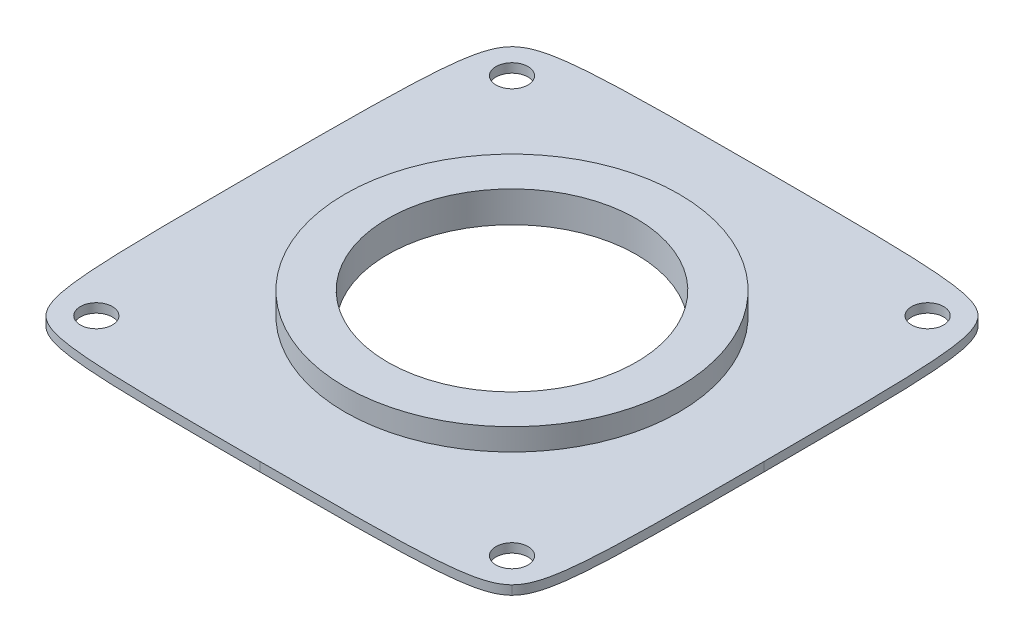
ISO-10303-21;
HEADER;
FILE_DESCRIPTION(('STEP AP214'),'2;1');
FILE_NAME('part.step','',(''),(''),'','','');
FILE_SCHEMA(('AUTOMOTIVE_DESIGN { 1 0 10303 214 1 1 1 1 }'));
ENDSEC;
DATA;
#1=APPLICATION_CONTEXT('core data for automotive mechanical design processes');
#2=APPLICATION_PROTOCOL_DEFINITION('international standard','automotive_design',2000,#1);
#3=PRODUCT_CONTEXT('',#1,'mechanical');
#4=PRODUCT('Part','Part','',(#3));
#5=PRODUCT_RELATED_PRODUCT_CATEGORY('part','',(#4));
#6=PRODUCT_DEFINITION_FORMATION('','',#4);
#7=PRODUCT_DEFINITION_CONTEXT('part definition',#1,'design');
#8=PRODUCT_DEFINITION('design','',#6,#7);
#9=PRODUCT_DEFINITION_SHAPE('','',#8);
#10=(LENGTH_UNIT() NAMED_UNIT(*) SI_UNIT(.MILLI.,.METRE.));
#11=(NAMED_UNIT(*) PLANE_ANGLE_UNIT() SI_UNIT($,.RADIAN.));
#12=(NAMED_UNIT(*) SI_UNIT($,.STERADIAN.) SOLID_ANGLE_UNIT());
#13=UNCERTAINTY_MEASURE_WITH_UNIT(LENGTH_MEASURE(1.E-05),#10,'distance_accuracy_value','');
#14=(GEOMETRIC_REPRESENTATION_CONTEXT(3) GLOBAL_UNCERTAINTY_ASSIGNED_CONTEXT((#13)) GLOBAL_UNIT_ASSIGNED_CONTEXT((#10,
#11,#12)) REPRESENTATION_CONTEXT('',''));
#15=CARTESIAN_POINT('',(0.,0.,0.));
#16=DIRECTION('',(0.,0.,1.));
#17=DIRECTION('',(1.,0.,0.));
#18=AXIS2_PLACEMENT_3D('',#15,#16,#17);
#19=CARTESIAN_POINT('',(24.4868745850218,1.28,-35.083973076749));
#20=DIRECTION('',(0.,1.,0.));
#21=DIRECTION('',(0.,0.,1.));
#22=AXIS2_PLACEMENT_3D('',#19,#20,#21);
#23=PLANE('',#22);
#24=CARTESIAN_POINT('',(0.,1.28,0.));
#25=DIRECTION('',(0.,1.,0.));
#26=DIRECTION('',(0.,0.,1.));
#27=AXIS2_PLACEMENT_3D('',#24,#25,#26);
#28=CIRCLE('',#27,23.5);
#29=CARTESIAN_POINT('',(0.,1.28,23.5));
#30=VERTEX_POINT('',#29);
#31=EDGE_CURVE('E252',#30,#30,#28,.T.);
#32=ORIENTED_EDGE('',*,*,#31,.F.);
#33=EDGE_LOOP('',(#32));
#34=FACE_BOUND('',#33,.T.);
#35=CARTESIAN_POINT('',(-29.2530075376859,1.28,29.2530075376891));
#36=DIRECTION('',(0.,1.,0.));
#37=DIRECTION('',(0.,0.,1.));
#38=AXIS2_PLACEMENT_3D('',#35,#36,#37);
#39=CIRCLE('',#38,2.2500000000012);
#40=CARTESIAN_POINT('',(-29.2530075376859,1.28,27.0030075376879));
#41=VERTEX_POINT('',#40);
#42=EDGE_CURVE('E260',#41,#41,#39,.T.);
#43=ORIENTED_EDGE('',*,*,#42,.F.);
#44=EDGE_LOOP('',(#43));
#45=FACE_BOUND('',#44,.T.);
#46=CARTESIAN_POINT('',(32.7950697151676,1.28,-32.7950697151676));
#47=CARTESIAN_POINT('',(30.2979011307272,1.28,-35.292238299608));
#48=CARTESIAN_POINT('',(24.0687411909418,1.28,-35.5));
#49=CARTESIAN_POINT('',(0.,1.28,-35.5));
#50=B_SPLINE_CURVE_WITH_KNOTS('',3,(#46,#47,#48,#49),.UNSPECIFIED.,.F.,.F.,(4,4),(0.,1.),.UNSPECIFIED.);
#51=CARTESIAN_POINT('',(32.7950697151676,1.28,-32.7950697151676));
#52=VERTEX_POINT('',#51);
#53=CARTESIAN_POINT('',(0.,1.28,-35.5));
#54=VERTEX_POINT('',#53);
#55=EDGE_CURVE('E280',#52,#54,#50,.T.);
#56=ORIENTED_EDGE('',*,*,#55,.T.);
#57=CARTESIAN_POINT('',(0.,1.28,-35.5));
#58=CARTESIAN_POINT('',(-24.0687411909418,1.28,-35.5));
#59=CARTESIAN_POINT('',(-30.2979011307272,1.28,-35.292238299608));
#60=CARTESIAN_POINT('',(-32.7950697151676,1.28,-32.7950697151676));
#61=B_SPLINE_CURVE_WITH_KNOTS('',3,(#57,#58,#59,#60),.UNSPECIFIED.,.F.,.F.,(4,4),(0.,1.),.UNSPECIFIED.);
#62=CARTESIAN_POINT('',(-32.7950697151676,1.28,-32.7950697151676));
#63=VERTEX_POINT('',#62);
#64=EDGE_CURVE('E102',#54,#63,#61,.T.);
#65=ORIENTED_EDGE('',*,*,#64,.T.);
#66=CARTESIAN_POINT('',(-32.7950697151676,1.28,-32.7950697151676));
#67=CARTESIAN_POINT('',(-35.292238299608,1.28,-30.2979011307272));
#68=CARTESIAN_POINT('',(-35.5,1.28,-24.0687411909418));
#69=CARTESIAN_POINT('',(-35.5,1.28,0.));
#70=B_SPLINE_CURVE_WITH_KNOTS('',3,(#66,#67,#68,#69),.UNSPECIFIED.,.F.,.F.,(4,4),(0.,1.),.UNSPECIFIED.);
#71=CARTESIAN_POINT('',(-35.5,1.28,0.));
#72=VERTEX_POINT('',#71);
#73=EDGE_CURVE('E177',#63,#72,#70,.T.);
#74=ORIENTED_EDGE('',*,*,#73,.T.);
#75=CARTESIAN_POINT('',(-35.5,1.28,0.));
#76=CARTESIAN_POINT('',(-35.5,1.28,24.0687411909418));
#77=CARTESIAN_POINT('',(-35.292238299608,1.28,30.2979011307272));
#78=CARTESIAN_POINT('',(-32.7950697151676,1.28,32.7950697151676));
#79=B_SPLINE_CURVE_WITH_KNOTS('',3,(#75,#76,#77,#78),.UNSPECIFIED.,.F.,.F.,(4,4),(0.,1.),.UNSPECIFIED.);
#80=CARTESIAN_POINT('',(-32.7950697151676,1.28,32.7950697151676));
#81=VERTEX_POINT('',#80);
#82=EDGE_CURVE('E169',#72,#81,#79,.T.);
#83=ORIENTED_EDGE('',*,*,#82,.T.);
#84=CARTESIAN_POINT('',(-32.7950697151676,1.28,32.7950697151676));
#85=CARTESIAN_POINT('',(-30.2979011307272,1.28,35.2922382996081));
#86=CARTESIAN_POINT('',(-24.0687411909418,1.28,35.5));
#87=CARTESIAN_POINT('',(0.,1.28,35.5));
#88=B_SPLINE_CURVE_WITH_KNOTS('',3,(#84,#85,#86,#87),.UNSPECIFIED.,.F.,.F.,(4,4),(0.,1.),.UNSPECIFIED.);
#89=CARTESIAN_POINT('',(0.,1.28,35.5));
#90=VERTEX_POINT('',#89);
#91=EDGE_CURVE('E121',#81,#90,#88,.T.);
#92=ORIENTED_EDGE('',*,*,#91,.T.);
#93=CARTESIAN_POINT('',(0.,1.28,35.5));
#94=CARTESIAN_POINT('',(24.0687411909418,1.28,35.5));
#95=CARTESIAN_POINT('',(30.2979011307272,1.28,35.292238299608));
#96=CARTESIAN_POINT('',(32.7950697151676,1.28,32.7950697151676));
#97=B_SPLINE_CURVE_WITH_KNOTS('',3,(#93,#94,#95,#96),.UNSPECIFIED.,.F.,.F.,(4,4),(0.,1.),.UNSPECIFIED.);
#98=CARTESIAN_POINT('',(32.7950697151676,1.28,32.7950697151676));
#99=VERTEX_POINT('',#98);
#100=EDGE_CURVE('E115',#90,#99,#97,.T.);
#101=ORIENTED_EDGE('',*,*,#100,.T.);
#102=CARTESIAN_POINT('',(32.7950697151676,1.28,32.7950697151676));
#103=CARTESIAN_POINT('',(35.2922382996081,1.28,30.2979011307272));
#104=CARTESIAN_POINT('',(35.5,1.28,24.0687411909418));
#105=CARTESIAN_POINT('',(35.5,1.28,0.));
#106=B_SPLINE_CURVE_WITH_KNOTS('',3,(#102,#103,#104,#105),.UNSPECIFIED.,.F.,.F.,(4,4),(0.,1.),.UNSPECIFIED.);
#107=CARTESIAN_POINT('',(35.5,1.28,0.));
#108=VERTEX_POINT('',#107);
#109=EDGE_CURVE('E119',#99,#108,#106,.T.);
#110=ORIENTED_EDGE('',*,*,#109,.T.);
#111=CARTESIAN_POINT('',(35.5,1.28,0.));
#112=CARTESIAN_POINT('',(35.5,1.28,-24.0687411909418));
#113=CARTESIAN_POINT('',(35.292238299608,1.28,-30.2979011307272));
#114=CARTESIAN_POINT('',(32.7950697151676,1.28,-32.7950697151676));
#115=B_SPLINE_CURVE_WITH_KNOTS('',3,(#111,#112,#113,#114),.UNSPECIFIED.,.F.,.F.,(4,4),(0.,1.),.UNSPECIFIED.);
#116=EDGE_CURVE('E59',#108,#52,#115,.T.);
#117=ORIENTED_EDGE('',*,*,#116,.T.);
#118=EDGE_LOOP('',(#56,#65,#74,#83,#92,#101,#110,#117));
#119=FACE_BOUND('',#118,.T.);
#120=CARTESIAN_POINT('',(29.2530075376875,1.28,-29.2530075376875));
#121=DIRECTION('',(0.,1.,0.));
#122=DIRECTION('',(0.,0.,1.));
#123=AXIS2_PLACEMENT_3D('',#120,#121,#122);
#124=CIRCLE('',#123,2.25);
#125=CARTESIAN_POINT('',(29.2530075376875,1.28,-31.5030075376875));
#126=VERTEX_POINT('',#125);
#127=EDGE_CURVE('E275',#126,#126,#124,.T.);
#128=ORIENTED_EDGE('',*,*,#127,.F.);
#129=EDGE_LOOP('',(#128));
#130=FACE_BOUND('',#129,.T.);
#131=CARTESIAN_POINT('',(29.2530075376891,1.28,29.2530075376875));
#132=DIRECTION('',(0.,1.,0.));
#133=DIRECTION('',(0.,0.,1.));
#134=AXIS2_PLACEMENT_3D('',#131,#132,#133);
#135=CIRCLE('',#134,2.24999999999958);
#136=CARTESIAN_POINT('',(29.2530075376891,1.28,27.0030075376879));
#137=VERTEX_POINT('',#136);
#138=EDGE_CURVE('E266',#137,#137,#135,.T.);
#139=ORIENTED_EDGE('',*,*,#138,.F.);
#140=EDGE_LOOP('',(#139));
#141=FACE_BOUND('',#140,.T.);
#142=CARTESIAN_POINT('',(-29.2530075376875,1.28,-29.2530075376858));
#143=DIRECTION('',(0.,1.,0.));
#144=DIRECTION('',(0.,0.,1.));
#145=AXIS2_PLACEMENT_3D('',#142,#143,#144);
#146=CIRCLE('',#145,2.25000000000175);
#147=CARTESIAN_POINT('',(-29.2530075376875,1.28,-31.5030075376876));
#148=VERTEX_POINT('',#147);
#149=EDGE_CURVE('E250',#148,#148,#146,.T.);
#150=ORIENTED_EDGE('',*,*,#149,.F.);
#151=EDGE_LOOP('',(#150));
#152=FACE_BOUND('',#151,.T.);
#153=ADVANCED_FACE('F41',(#34,#45,#119,#130,#141,#152),#23,.T.);
#154=CARTESIAN_POINT('',(24.4868745850218,0.,-35.083973076749));
#155=DIRECTION('',(0.,1.,0.));
#156=DIRECTION('',(0.,0.,1.));
#157=AXIS2_PLACEMENT_3D('',#154,#155,#156);
#158=PLANE('',#157);
#159=CARTESIAN_POINT('',(32.7950697151676,0.,-32.7950697151676));
#160=CARTESIAN_POINT('',(30.2979011307272,0.,-35.292238299608));
#161=CARTESIAN_POINT('',(24.0687411909418,0.,-35.5));
#162=CARTESIAN_POINT('',(0.,0.,-35.5));
#163=B_SPLINE_CURVE_WITH_KNOTS('',3,(#159,#160,#161,#162),.UNSPECIFIED.,.F.,.F.,(4,4),(0.,1.),.UNSPECIFIED.);
#164=CARTESIAN_POINT('',(32.7950697151676,0.,-32.7950697151676));
#165=VERTEX_POINT('',#164);
#166=CARTESIAN_POINT('',(0.,0.,-35.5));
#167=VERTEX_POINT('',#166);
#168=EDGE_CURVE('E278',#165,#167,#163,.T.);
#169=ORIENTED_EDGE('',*,*,#168,.F.);
#170=CARTESIAN_POINT('',(35.5,0.,0.));
#171=CARTESIAN_POINT('',(35.5,0.,-24.0687411909418));
#172=CARTESIAN_POINT('',(35.292238299608,0.,-30.2979011307272));
#173=CARTESIAN_POINT('',(32.7950697151676,0.,-32.7950697151676));
#174=B_SPLINE_CURVE_WITH_KNOTS('',3,(#170,#171,#172,#173),.UNSPECIFIED.,.F.,.F.,(4,4),(0.,1.),.UNSPECIFIED.);
#175=CARTESIAN_POINT('',(35.5,0.,0.));
#176=VERTEX_POINT('',#175);
#177=EDGE_CURVE('E94',#176,#165,#174,.T.);
#178=ORIENTED_EDGE('',*,*,#177,.F.);
#179=CARTESIAN_POINT('',(32.7950697151676,0.,32.7950697151676));
#180=CARTESIAN_POINT('',(35.2922382996081,0.,30.2979011307272));
#181=CARTESIAN_POINT('',(35.5,0.,24.0687411909418));
#182=CARTESIAN_POINT('',(35.5,0.,0.));
#183=B_SPLINE_CURVE_WITH_KNOTS('',3,(#179,#180,#181,#182),.UNSPECIFIED.,.F.,.F.,(4,4),(0.,1.),.UNSPECIFIED.);
#184=CARTESIAN_POINT('',(32.7950697151676,0.,32.7950697151676));
#185=VERTEX_POINT('',#184);
#186=EDGE_CURVE('E88',#185,#176,#183,.T.);
#187=ORIENTED_EDGE('',*,*,#186,.F.);
#188=CARTESIAN_POINT('',(0.,0.,35.5));
#189=CARTESIAN_POINT('',(24.0687411909418,0.,35.5));
#190=CARTESIAN_POINT('',(30.2979011307272,0.,35.292238299608));
#191=CARTESIAN_POINT('',(32.7950697151676,0.,32.7950697151676));
#192=B_SPLINE_CURVE_WITH_KNOTS('',3,(#188,#189,#190,#191),.UNSPECIFIED.,.F.,.F.,(4,4),(0.,1.),.UNSPECIFIED.);
#193=CARTESIAN_POINT('',(0.,0.,35.5));
#194=VERTEX_POINT('',#193);
#195=EDGE_CURVE('E129',#194,#185,#192,.T.);
#196=ORIENTED_EDGE('',*,*,#195,.F.);
#197=CARTESIAN_POINT('',(-32.7950697151676,0.,32.7950697151676));
#198=CARTESIAN_POINT('',(-30.2979011307272,0.,35.2922382996081));
#199=CARTESIAN_POINT('',(-24.0687411909418,0.,35.5));
#200=CARTESIAN_POINT('',(0.,0.,35.5));
#201=B_SPLINE_CURVE_WITH_KNOTS('',3,(#197,#198,#199,#200),.UNSPECIFIED.,.F.,.F.,(4,4),(0.,1.),.UNSPECIFIED.);
#202=CARTESIAN_POINT('',(-32.7950697151676,0.,32.7950697151676));
#203=VERTEX_POINT('',#202);
#204=EDGE_CURVE('E320',#203,#194,#201,.T.);
#205=ORIENTED_EDGE('',*,*,#204,.F.);
#206=CARTESIAN_POINT('',(-35.5,0.,0.));
#207=CARTESIAN_POINT('',(-35.5,0.,24.0687411909418));
#208=CARTESIAN_POINT('',(-35.292238299608,0.,30.2979011307272));
#209=CARTESIAN_POINT('',(-32.7950697151676,0.,32.7950697151676));
#210=B_SPLINE_CURVE_WITH_KNOTS('',3,(#206,#207,#208,#209),.UNSPECIFIED.,.F.,.F.,(4,4),(0.,1.),.UNSPECIFIED.);
#211=CARTESIAN_POINT('',(-35.5,0.,0.));
#212=VERTEX_POINT('',#211);
#213=EDGE_CURVE('E318',#212,#203,#210,.T.);
#214=ORIENTED_EDGE('',*,*,#213,.F.);
#215=CARTESIAN_POINT('',(-32.7950697151676,0.,-32.7950697151676));
#216=CARTESIAN_POINT('',(-35.292238299608,0.,-30.2979011307272));
#217=CARTESIAN_POINT('',(-35.5,0.,-24.0687411909418));
#218=CARTESIAN_POINT('',(-35.5,0.,0.));
#219=B_SPLINE_CURVE_WITH_KNOTS('',3,(#215,#216,#217,#218),.UNSPECIFIED.,.F.,.F.,(4,4),(0.,1.),.UNSPECIFIED.);
#220=CARTESIAN_POINT('',(-32.7950697151676,0.,-32.7950697151676));
#221=VERTEX_POINT('',#220);
#222=EDGE_CURVE('E312',#221,#212,#219,.T.);
#223=ORIENTED_EDGE('',*,*,#222,.F.);
#224=CARTESIAN_POINT('',(0.,0.,-35.5));
#225=CARTESIAN_POINT('',(-24.0687411909418,0.,-35.5));
#226=CARTESIAN_POINT('',(-30.2979011307272,0.,-35.292238299608));
#227=CARTESIAN_POINT('',(-32.7950697151676,0.,-32.7950697151676));
#228=B_SPLINE_CURVE_WITH_KNOTS('',3,(#224,#225,#226,#227),.UNSPECIFIED.,.F.,.F.,(4,4),(0.,1.),.UNSPECIFIED.);
#229=EDGE_CURVE('E316',#167,#221,#228,.T.);
#230=ORIENTED_EDGE('',*,*,#229,.F.);
#231=EDGE_LOOP('',(#169,#178,#187,#196,#205,#214,#223,#230));
#232=FACE_BOUND('',#231,.T.);
#233=CARTESIAN_POINT('',(29.2530075376875,0.,-29.2530075376875));
#234=DIRECTION('',(0.,1.,0.));
#235=DIRECTION('',(0.,0.,1.));
#236=AXIS2_PLACEMENT_3D('',#233,#234,#235);
#237=CIRCLE('',#236,2.25);
#238=CARTESIAN_POINT('',(29.2530075376875,0.,-31.5030075376875));
#239=VERTEX_POINT('',#238);
#240=EDGE_CURVE('E274',#239,#239,#237,.T.);
#241=ORIENTED_EDGE('',*,*,#240,.T.);
#242=EDGE_LOOP('',(#241));
#243=FACE_BOUND('',#242,.T.);
#244=CARTESIAN_POINT('',(0.,0.,0.));
#245=DIRECTION('',(0.,1.,0.));
#246=DIRECTION('',(0.,0.,1.));
#247=AXIS2_PLACEMENT_3D('',#244,#245,#246);
#248=CIRCLE('',#247,17.5);
#249=CARTESIAN_POINT('',(0.,0.,-17.5));
#250=VERTEX_POINT('',#249);
#251=EDGE_CURVE('E269',#250,#250,#248,.T.);
#252=ORIENTED_EDGE('',*,*,#251,.T.);
#253=EDGE_LOOP('',(#252));
#254=FACE_BOUND('',#253,.T.);
#255=CARTESIAN_POINT('',(29.2530075376891,0.,29.2530075376875));
#256=DIRECTION('',(0.,1.,0.));
#257=DIRECTION('',(0.,0.,1.));
#258=AXIS2_PLACEMENT_3D('',#255,#256,#257);
#259=CIRCLE('',#258,2.24999999999958);
#260=CARTESIAN_POINT('',(29.2530075376891,0.,27.0030075376879));
#261=VERTEX_POINT('',#260);
#262=EDGE_CURVE('E263',#261,#261,#259,.T.);
#263=ORIENTED_EDGE('',*,*,#262,.T.);
#264=EDGE_LOOP('',(#263));
#265=FACE_BOUND('',#264,.T.);
#266=CARTESIAN_POINT('',(-29.2530075376859,0.,29.2530075376891));
#267=DIRECTION('',(0.,1.,0.));
#268=DIRECTION('',(0.,0.,1.));
#269=AXIS2_PLACEMENT_3D('',#266,#267,#268);
#270=CIRCLE('',#269,2.2500000000012);
#271=CARTESIAN_POINT('',(-29.2530075376859,0.,27.0030075376879));
#272=VERTEX_POINT('',#271);
#273=EDGE_CURVE('E258',#272,#272,#270,.T.);
#274=ORIENTED_EDGE('',*,*,#273,.T.);
#275=EDGE_LOOP('',(#274));
#276=FACE_BOUND('',#275,.T.);
#277=CARTESIAN_POINT('',(-29.2530075376875,0.,-29.2530075376858));
#278=DIRECTION('',(0.,1.,0.));
#279=DIRECTION('',(0.,0.,1.));
#280=AXIS2_PLACEMENT_3D('',#277,#278,#279);
#281=CIRCLE('',#280,2.25000000000175);
#282=CARTESIAN_POINT('',(-29.2530075376875,0.,-31.5030075376876));
#283=VERTEX_POINT('',#282);
#284=EDGE_CURVE('E247',#283,#283,#281,.T.);
#285=ORIENTED_EDGE('',*,*,#284,.T.);
#286=EDGE_LOOP('',(#285));
#287=FACE_BOUND('',#286,.T.);
#288=ADVANCED_FACE('F199',(#232,#243,#254,#265,#276,#287),#158,.F.);
#289=DIRECTION('',(0.,-1.,0.));
#290=VECTOR('',#289,1.);
#291=SURFACE_OF_LINEAR_EXTRUSION('',#50,#290);
#292=ORIENTED_EDGE('',*,*,#168,.T.);
#293=DIRECTION('',(0.,-1.,0.));
#294=VECTOR('',#293,1.);
#295=CARTESIAN_POINT('',(0.,1.28,-35.5));
#296=LINE('',#295,#294);
#297=EDGE_CURVE('E11',#54,#167,#296,.T.);
#298=ORIENTED_EDGE('',*,*,#297,.F.);
#299=ORIENTED_EDGE('',*,*,#55,.F.);
#300=DIRECTION('',(0.,-1.,0.));
#301=VECTOR('',#300,1.);
#302=CARTESIAN_POINT('',(32.7950697151676,1.28,-32.7950697151676));
#303=LINE('',#302,#301);
#304=EDGE_CURVE('E135',#52,#165,#303,.T.);
#305=ORIENTED_EDGE('',*,*,#304,.T.);
#306=EDGE_LOOP('',(#292,#298,#299,#305));
#307=FACE_BOUND('',#306,.T.);
#308=ADVANCED_FACE('F43',(#307),#291,.F.);
#309=DIRECTION('',(0.,-1.,0.));
#310=VECTOR('',#309,1.);
#311=SURFACE_OF_LINEAR_EXTRUSION('',#61,#310);
#312=ORIENTED_EDGE('',*,*,#229,.T.);
#313=DIRECTION('',(0.,-1.,0.));
#314=VECTOR('',#313,1.);
#315=CARTESIAN_POINT('',(-32.7950697151676,1.28,-32.7950697151676));
#316=LINE('',#315,#314);
#317=EDGE_CURVE('E51',#63,#221,#316,.T.);
#318=ORIENTED_EDGE('',*,*,#317,.F.);
#319=ORIENTED_EDGE('',*,*,#64,.F.);
#320=ORIENTED_EDGE('',*,*,#297,.T.);
#321=EDGE_LOOP('',(#312,#318,#319,#320));
#322=FACE_BOUND('',#321,.T.);
#323=ADVANCED_FACE('F193',(#322),#311,.F.);
#324=DIRECTION('',(0.,-1.,0.));
#325=VECTOR('',#324,1.);
#326=SURFACE_OF_LINEAR_EXTRUSION('',#70,#325);
#327=ORIENTED_EDGE('',*,*,#222,.T.);
#328=DIRECTION('',(0.,-1.,0.));
#329=VECTOR('',#328,1.);
#330=CARTESIAN_POINT('',(-35.5,1.28,0.));
#331=LINE('',#330,#329);
#332=EDGE_CURVE('E306',#72,#212,#331,.T.);
#333=ORIENTED_EDGE('',*,*,#332,.F.);
#334=ORIENTED_EDGE('',*,*,#73,.F.);
#335=ORIENTED_EDGE('',*,*,#317,.T.);
#336=EDGE_LOOP('',(#327,#333,#334,#335));
#337=FACE_BOUND('',#336,.T.);
#338=ADVANCED_FACE('F191',(#337),#326,.F.);
#339=DIRECTION('',(0.,-1.,0.));
#340=VECTOR('',#339,1.);
#341=SURFACE_OF_LINEAR_EXTRUSION('',#79,#340);
#342=ORIENTED_EDGE('',*,*,#213,.T.);
#343=DIRECTION('',(0.,-1.,0.));
#344=VECTOR('',#343,1.);
#345=CARTESIAN_POINT('',(-32.7950697151676,1.28,32.7950697151676));
#346=LINE('',#345,#344);
#347=EDGE_CURVE('E303',#81,#203,#346,.T.);
#348=ORIENTED_EDGE('',*,*,#347,.F.);
#349=ORIENTED_EDGE('',*,*,#82,.F.);
#350=ORIENTED_EDGE('',*,*,#332,.T.);
#351=EDGE_LOOP('',(#342,#348,#349,#350));
#352=FACE_BOUND('',#351,.T.);
#353=ADVANCED_FACE('F162',(#352),#341,.F.);
#354=DIRECTION('',(0.,-1.,0.));
#355=VECTOR('',#354,1.);
#356=SURFACE_OF_LINEAR_EXTRUSION('',#88,#355);
#357=ORIENTED_EDGE('',*,*,#204,.T.);
#358=DIRECTION('',(0.,-1.,0.));
#359=VECTOR('',#358,1.);
#360=CARTESIAN_POINT('',(0.,1.28,35.5));
#361=LINE('',#360,#359);
#362=EDGE_CURVE('E130',#90,#194,#361,.T.);
#363=ORIENTED_EDGE('',*,*,#362,.F.);
#364=ORIENTED_EDGE('',*,*,#91,.F.);
#365=ORIENTED_EDGE('',*,*,#347,.T.);
#366=EDGE_LOOP('',(#357,#363,#364,#365));
#367=FACE_BOUND('',#366,.T.);
#368=ADVANCED_FACE('F159',(#367),#356,.F.);
#369=DIRECTION('',(0.,-1.,0.));
#370=VECTOR('',#369,1.);
#371=SURFACE_OF_LINEAR_EXTRUSION('',#97,#370);
#372=ORIENTED_EDGE('',*,*,#195,.T.);
#373=DIRECTION('',(0.,-1.,0.));
#374=VECTOR('',#373,1.);
#375=CARTESIAN_POINT('',(32.7950697151676,1.28,32.7950697151676));
#376=LINE('',#375,#374);
#377=EDGE_CURVE('E126',#99,#185,#376,.T.);
#378=ORIENTED_EDGE('',*,*,#377,.F.);
#379=ORIENTED_EDGE('',*,*,#100,.F.);
#380=ORIENTED_EDGE('',*,*,#362,.T.);
#381=EDGE_LOOP('',(#372,#378,#379,#380));
#382=FACE_BOUND('',#381,.T.);
#383=ADVANCED_FACE('F127',(#382),#371,.F.);
#384=DIRECTION('',(0.,-1.,0.));
#385=VECTOR('',#384,1.);
#386=SURFACE_OF_LINEAR_EXTRUSION('',#106,#385);
#387=ORIENTED_EDGE('',*,*,#186,.T.);
#388=DIRECTION('',(0.,-1.,0.));
#389=VECTOR('',#388,1.);
#390=CARTESIAN_POINT('',(35.5,1.28,0.));
#391=LINE('',#390,#389);
#392=EDGE_CURVE('E131',#108,#176,#391,.T.);
#393=ORIENTED_EDGE('',*,*,#392,.F.);
#394=ORIENTED_EDGE('',*,*,#109,.F.);
#395=ORIENTED_EDGE('',*,*,#377,.T.);
#396=EDGE_LOOP('',(#387,#393,#394,#395));
#397=FACE_BOUND('',#396,.T.);
#398=ADVANCED_FACE('F133',(#397),#386,.F.);
#399=DIRECTION('',(0.,-1.,0.));
#400=VECTOR('',#399,1.);
#401=SURFACE_OF_LINEAR_EXTRUSION('',#115,#400);
#402=ORIENTED_EDGE('',*,*,#177,.T.);
#403=ORIENTED_EDGE('',*,*,#304,.F.);
#404=ORIENTED_EDGE('',*,*,#116,.F.);
#405=ORIENTED_EDGE('',*,*,#392,.T.);
#406=EDGE_LOOP('',(#402,#403,#404,#405));
#407=FACE_BOUND('',#406,.T.);
#408=ADVANCED_FACE('F155',(#407),#401,.F.);
#409=CARTESIAN_POINT('',(29.2530075376875,1.28,-29.2530075376875));
#410=DIRECTION('',(0.,-1.,0.));
#411=DIRECTION('',(0.,0.,-1.));
#412=AXIS2_PLACEMENT_3D('',#409,#410,#411);
#413=CYLINDRICAL_SURFACE('',#412,2.25);
#414=CARTESIAN_POINT('',(29.2530075376875,1.28,-31.5030075376875));
#415=CARTESIAN_POINT('',(29.2530075376875,1.26666666666667,-31.5030075376875));
#416=CARTESIAN_POINT('',(29.2530075376875,1.25333333333333,-31.5030075376875));
#417=CARTESIAN_POINT('',(29.2530075376875,1.22666666666667,-31.5030075376875));
#418=CARTESIAN_POINT('',(29.2530075376875,1.21333333333333,-31.5030075376875));
#419=CARTESIAN_POINT('',(29.2530075376875,1.18666666666667,-31.5030075376875));
#420=CARTESIAN_POINT('',(29.2530075376875,1.17333333333333,-31.5030075376875));
#421=CARTESIAN_POINT('',(29.2530075376875,1.14666666666667,-31.5030075376875));
#422=CARTESIAN_POINT('',(29.2530075376875,1.13333333333333,-31.5030075376875));
#423=CARTESIAN_POINT('',(29.2530075376875,1.10666666666667,-31.5030075376875));
#424=CARTESIAN_POINT('',(29.2530075376875,1.09333333333333,-31.5030075376875));
#425=CARTESIAN_POINT('',(29.2530075376875,1.06666666666667,-31.5030075376875));
#426=CARTESIAN_POINT('',(29.2530075376875,1.05333333333333,-31.5030075376875));
#427=CARTESIAN_POINT('',(29.2530075376875,1.02666666666667,-31.5030075376875));
#428=CARTESIAN_POINT('',(29.2530075376875,1.01333333333333,-31.5030075376875));
#429=CARTESIAN_POINT('',(29.2530075376875,0.986666666666667,-31.5030075376875));
#430=CARTESIAN_POINT('',(29.2530075376875,0.973333333333333,-31.5030075376875));
#431=CARTESIAN_POINT('',(29.2530075376875,0.946666666666667,-31.5030075376875));
#432=CARTESIAN_POINT('',(29.2530075376875,0.933333333333333,-31.5030075376875));
#433=CARTESIAN_POINT('',(29.2530075376875,0.906666666666667,-31.5030075376875));
#434=CARTESIAN_POINT('',(29.2530075376875,0.893333333333333,-31.5030075376875));
#435=CARTESIAN_POINT('',(29.2530075376875,0.866666666666667,-31.5030075376875));
#436=CARTESIAN_POINT('',(29.2530075376875,0.853333333333333,-31.5030075376875));
#437=CARTESIAN_POINT('',(29.2530075376875,0.826666666666667,-31.5030075376875));
#438=CARTESIAN_POINT('',(29.2530075376875,0.813333333333333,-31.5030075376875));
#439=CARTESIAN_POINT('',(29.2530075376875,0.786666666666667,-31.5030075376875));
#440=CARTESIAN_POINT('',(29.2530075376875,0.773333333333333,-31.5030075376875));
#441=CARTESIAN_POINT('',(29.2530075376875,0.746666666666667,-31.5030075376875));
#442=CARTESIAN_POINT('',(29.2530075376875,0.733333333333333,-31.5030075376875));
#443=CARTESIAN_POINT('',(29.2530075376875,0.706666666666667,-31.5030075376875));
#444=CARTESIAN_POINT('',(29.2530075376875,0.693333333333333,-31.5030075376875));
#445=CARTESIAN_POINT('',(29.2530075376875,0.666666666666667,-31.5030075376875));
#446=CARTESIAN_POINT('',(29.2530075376875,0.653333333333333,-31.5030075376875));
#447=CARTESIAN_POINT('',(29.2530075376875,0.626666666666667,-31.5030075376875));
#448=CARTESIAN_POINT('',(29.2530075376875,0.613333333333333,-31.5030075376875));
#449=CARTESIAN_POINT('',(29.2530075376875,0.586666666666667,-31.5030075376875));
#450=CARTESIAN_POINT('',(29.2530075376875,0.573333333333333,-31.5030075376875));
#451=CARTESIAN_POINT('',(29.2530075376875,0.546666666666667,-31.5030075376875));
#452=CARTESIAN_POINT('',(29.2530075376875,0.533333333333333,-31.5030075376875));
#453=CARTESIAN_POINT('',(29.2530075376875,0.506666666666667,-31.5030075376875));
#454=CARTESIAN_POINT('',(29.2530075376875,0.493333333333333,-31.5030075376875));
#455=CARTESIAN_POINT('',(29.2530075376875,0.466666666666667,-31.5030075376875));
#456=CARTESIAN_POINT('',(29.2530075376875,0.453333333333333,-31.5030075376875));
#457=CARTESIAN_POINT('',(29.2530075376875,0.426666666666667,-31.5030075376875));
#458=CARTESIAN_POINT('',(29.2530075376875,0.413333333333333,-31.5030075376875));
#459=CARTESIAN_POINT('',(29.2530075376875,0.386666666666666,-31.5030075376875));
#460=CARTESIAN_POINT('',(29.2530075376875,0.373333333333333,-31.5030075376875));
#461=CARTESIAN_POINT('',(29.2530075376875,0.346666666666667,-31.5030075376875));
#462=CARTESIAN_POINT('',(29.2530075376875,0.333333333333333,-31.5030075376875));
#463=CARTESIAN_POINT('',(29.2530075376875,0.306666666666667,-31.5030075376875));
#464=CARTESIAN_POINT('',(29.2530075376875,0.293333333333333,-31.5030075376875));
#465=CARTESIAN_POINT('',(29.2530075376875,0.266666666666667,-31.5030075376875));
#466=CARTESIAN_POINT('',(29.2530075376875,0.253333333333333,-31.5030075376875));
#467=CARTESIAN_POINT('',(29.2530075376875,0.226666666666667,-31.5030075376875));
#468=CARTESIAN_POINT('',(29.2530075376875,0.213333333333333,-31.5030075376875));
#469=CARTESIAN_POINT('',(29.2530075376875,0.186666666666667,-31.5030075376875));
#470=CARTESIAN_POINT('',(29.2530075376875,0.173333333333333,-31.5030075376875));
#471=CARTESIAN_POINT('',(29.2530075376875,0.146666666666667,-31.5030075376875));
#472=CARTESIAN_POINT('',(29.2530075376875,0.133333333333333,-31.5030075376875));
#473=CARTESIAN_POINT('',(29.2530075376875,0.106666666666667,-31.5030075376875));
#474=CARTESIAN_POINT('',(29.2530075376875,0.0933333333333334,-31.5030075376875));
#475=CARTESIAN_POINT('',(29.2530075376875,0.0666666666666667,-31.5030075376875));
#476=CARTESIAN_POINT('',(29.2530075376875,0.0533333333333334,-31.5030075376875));
#477=CARTESIAN_POINT('',(29.2530075376875,0.0266666666666667,-31.5030075376875));
#478=CARTESIAN_POINT('',(29.2530075376875,0.0133333333333334,-31.5030075376875));
#479=CARTESIAN_POINT('',(29.2530075376875,0.,-31.5030075376875));
#480=B_SPLINE_CURVE_WITH_KNOTS('',3,(#414,#415,#416,#417,#418,#419,#420,#421,#422,#423,#424,
#425,#426,#427,#428,#429,#430,#431,#432,#433,#434,#435,#436,#437,#438,#439,#440,#441,#442,#443,
#444,#445,#446,#447,#448,#449,#450,#451,#452,#453,#454,#455,#456,#457,#458,#459,#460,#461,#462,
#463,#464,#465,#466,#467,#468,#469,#470,#471,#472,#473,#474,#475,#476,#477,#478,#479),
.UNSPECIFIED.,.F.,.F.,(4,2,2,2,2,2,2,2,2,2,2,2,2,2,2,2,2,2,2,2,2,2,2,2,2,2,2,2,2,2,2,2,4),(0.,
0.0400000000000001,0.0800000000000002,0.12,0.16,0.2,0.24,0.28,0.32,0.36,0.4,0.44,0.48,0.52,0.56,
0.6,0.64,0.68,0.72,0.76,0.8,0.84,0.88,0.92,0.96,1.,1.04,1.08,1.12,1.16,1.2,1.24,1.28),.UNSPECIFIED.);
#481=EDGE_CURVE('BSEAM211',#126,#239,#480,.T.);
#482=ORIENTED_EDGE('',*,*,#127,.T.);
#483=ORIENTED_EDGE('',*,*,#240,.F.);
#484=ORIENTED_EDGE('',*,*,#481,.T.);
#485=ORIENTED_EDGE('',*,*,#481,.F.);
#486=EDGE_LOOP('',(#482,#484,#483,#485));
#487=FACE_BOUND('',#486,.T.);
#488=ADVANCED_FACE('F211',(#487),#413,.F.);
#489=CARTESIAN_POINT('',(0.,1.28,0.));
#490=DIRECTION('',(0.,-1.,0.));
#491=DIRECTION('',(0.,0.,-1.));
#492=AXIS2_PLACEMENT_3D('',#489,#490,#491);
#493=CYLINDRICAL_SURFACE('',#492,17.5);
#494=CARTESIAN_POINT('',(0.,4.37,0.));
#495=DIRECTION('',(0.,1.,0.));
#496=DIRECTION('',(0.,0.,1.));
#497=AXIS2_PLACEMENT_3D('',#494,#495,#496);
#498=CIRCLE('',#497,17.5);
#499=CARTESIAN_POINT('',(0.,4.37,-17.5));
#500=VERTEX_POINT('',#499);
#501=EDGE_CURVE('E243',#500,#500,#498,.F.);
#502=CARTESIAN_POINT('',(0.,0.,-17.5));
#503=CARTESIAN_POINT('',(0.,0.0455208333333333,-17.5));
#504=CARTESIAN_POINT('',(0.,0.0910416666666666,-17.5));
#505=CARTESIAN_POINT('',(0.,0.182083333333333,-17.5));
#506=CARTESIAN_POINT('',(0.,0.227604166666667,-17.5));
#507=CARTESIAN_POINT('',(0.,0.318645833333333,-17.5));
#508=CARTESIAN_POINT('',(0.,0.364166666666667,-17.5));
#509=CARTESIAN_POINT('',(0.,0.455208333333333,-17.5));
#510=CARTESIAN_POINT('',(0.,0.500729166666667,-17.5));
#511=CARTESIAN_POINT('',(0.,0.591770833333333,-17.5));
#512=CARTESIAN_POINT('',(0.,0.637291666666667,-17.5));
#513=CARTESIAN_POINT('',(0.,0.728333333333333,-17.5));
#514=CARTESIAN_POINT('',(0.,0.773854166666667,-17.5));
#515=CARTESIAN_POINT('',(0.,0.864895833333333,-17.5));
#516=CARTESIAN_POINT('',(0.,0.910416666666667,-17.5));
#517=CARTESIAN_POINT('',(0.,1.00145833333333,-17.5));
#518=CARTESIAN_POINT('',(0.,1.04697916666667,-17.5));
#519=CARTESIAN_POINT('',(0.,1.13802083333333,-17.5));
#520=CARTESIAN_POINT('',(0.,1.18354166666667,-17.5));
#521=CARTESIAN_POINT('',(0.,1.27458333333333,-17.5));
#522=CARTESIAN_POINT('',(0.,1.32010416666667,-17.5));
#523=CARTESIAN_POINT('',(0.,1.41114583333333,-17.5));
#524=CARTESIAN_POINT('',(0.,1.45666666666667,-17.5));
#525=CARTESIAN_POINT('',(0.,1.54770833333333,-17.5));
#526=CARTESIAN_POINT('',(0.,1.59322916666667,-17.5));
#527=CARTESIAN_POINT('',(0.,1.68427083333333,-17.5));
#528=CARTESIAN_POINT('',(0.,1.72979166666667,-17.5));
#529=CARTESIAN_POINT('',(0.,1.82083333333333,-17.5));
#530=CARTESIAN_POINT('',(0.,1.86635416666667,-17.5));
#531=CARTESIAN_POINT('',(0.,1.95739583333333,-17.5));
#532=CARTESIAN_POINT('',(0.,2.00291666666667,-17.5));
#533=CARTESIAN_POINT('',(0.,2.09395833333333,-17.5));
#534=CARTESIAN_POINT('',(0.,2.13947916666667,-17.5));
#535=CARTESIAN_POINT('',(0.,2.23052083333333,-17.5));
#536=CARTESIAN_POINT('',(0.,2.27604166666667,-17.5));
#537=CARTESIAN_POINT('',(0.,2.36708333333333,-17.5));
#538=CARTESIAN_POINT('',(0.,2.41260416666667,-17.5));
#539=CARTESIAN_POINT('',(0.,2.50364583333333,-17.5));
#540=CARTESIAN_POINT('',(0.,2.54916666666667,-17.5));
#541=CARTESIAN_POINT('',(0.,2.64020833333333,-17.5));
#542=CARTESIAN_POINT('',(0.,2.68572916666667,-17.5));
#543=CARTESIAN_POINT('',(0.,2.77677083333333,-17.5));
#544=CARTESIAN_POINT('',(0.,2.82229166666667,-17.5));
#545=CARTESIAN_POINT('',(0.,2.91333333333333,-17.5));
#546=CARTESIAN_POINT('',(0.,2.95885416666667,-17.5));
#547=CARTESIAN_POINT('',(0.,3.04989583333333,-17.5));
#548=CARTESIAN_POINT('',(0.,3.09541666666667,-17.5));
#549=CARTESIAN_POINT('',(0.,3.18645833333333,-17.5));
#550=CARTESIAN_POINT('',(0.,3.23197916666667,-17.5));
#551=CARTESIAN_POINT('',(0.,3.32302083333333,-17.5));
#552=CARTESIAN_POINT('',(0.,3.36854166666667,-17.5));
#553=CARTESIAN_POINT('',(0.,3.45958333333333,-17.5));
#554=CARTESIAN_POINT('',(0.,3.50510416666667,-17.5));
#555=CARTESIAN_POINT('',(0.,3.59614583333333,-17.5));
#556=CARTESIAN_POINT('',(0.,3.64166666666667,-17.5));
#557=CARTESIAN_POINT('',(0.,3.73270833333333,-17.5));
#558=CARTESIAN_POINT('',(0.,3.77822916666667,-17.5));
#559=CARTESIAN_POINT('',(0.,3.86927083333333,-17.5));
#560=CARTESIAN_POINT('',(0.,3.91479166666667,-17.5));
#561=CARTESIAN_POINT('',(0.,4.00583333333333,-17.5));
#562=CARTESIAN_POINT('',(0.,4.05135416666667,-17.5));
#563=CARTESIAN_POINT('',(0.,4.14239583333333,-17.5));
#564=CARTESIAN_POINT('',(0.,4.18791666666667,-17.5));
#565=CARTESIAN_POINT('',(0.,4.27895833333333,-17.5));
#566=CARTESIAN_POINT('',(0.,4.32447916666667,-17.5));
#567=CARTESIAN_POINT('',(0.,4.37,-17.5));
#568=B_SPLINE_CURVE_WITH_KNOTS('',3,(#502,#503,#504,#505,#506,#507,#508,#509,#510,#511,#512,
#513,#514,#515,#516,#517,#518,#519,#520,#521,#522,#523,#524,#525,#526,#527,#528,#529,#530,#531,
#532,#533,#534,#535,#536,#537,#538,#539,#540,#541,#542,#543,#544,#545,#546,#547,#548,#549,#550,
#551,#552,#553,#554,#555,#556,#557,#558,#559,#560,#561,#562,#563,#564,#565,#566,#567),
.UNSPECIFIED.,.F.,.F.,(4,2,2,2,2,2,2,2,2,2,2,2,2,2,2,2,2,2,2,2,2,2,2,2,2,2,2,2,2,2,2,2,4),(0.,
0.1365625,0.273125,0.4096875,0.54625,0.6828125,0.819375,0.9559375,1.0925,1.2290625,1.365625,
1.5021875,1.63875,1.7753125,1.911875,2.0484375,2.185,2.3215625,2.458125,2.5946875,2.73125,
2.8678125,3.004375,3.1409375,3.2775,3.4140625,3.550625,3.6871875,3.82375,3.9603125,4.096875,
4.2334375,4.37),.UNSPECIFIED.);
#569=EDGE_CURVE('BSEAM214',#250,#500,#568,.T.);
#570=ORIENTED_EDGE('',*,*,#251,.F.);
#571=ORIENTED_EDGE('',*,*,#501,.F.);
#572=ORIENTED_EDGE('',*,*,#569,.T.);
#573=ORIENTED_EDGE('',*,*,#569,.F.);
#574=EDGE_LOOP('',(#570,#572,#571,#573));
#575=FACE_BOUND('',#574,.T.);
#576=ADVANCED_FACE('F214',(#575),#493,.F.);
#577=CARTESIAN_POINT('',(29.2530075376891,1.28,29.2530075376875));
#578=DIRECTION('',(0.,-1.,0.));
#579=DIRECTION('',(0.,0.,-1.));
#580=AXIS2_PLACEMENT_3D('',#577,#578,#579);
#581=CYLINDRICAL_SURFACE('',#580,2.24999999999958);
#582=CARTESIAN_POINT('',(29.2530075376891,1.28,27.0030075376879));
#583=CARTESIAN_POINT('',(29.2530075376891,1.26666666666667,27.0030075376879));
#584=CARTESIAN_POINT('',(29.2530075376891,1.25333333333333,27.0030075376879));
#585=CARTESIAN_POINT('',(29.2530075376891,1.22666666666667,27.0030075376879));
#586=CARTESIAN_POINT('',(29.2530075376891,1.21333333333333,27.0030075376879));
#587=CARTESIAN_POINT('',(29.2530075376891,1.18666666666667,27.0030075376879));
#588=CARTESIAN_POINT('',(29.2530075376891,1.17333333333333,27.0030075376879));
#589=CARTESIAN_POINT('',(29.2530075376891,1.14666666666667,27.0030075376879));
#590=CARTESIAN_POINT('',(29.2530075376891,1.13333333333333,27.0030075376879));
#591=CARTESIAN_POINT('',(29.2530075376891,1.10666666666667,27.0030075376879));
#592=CARTESIAN_POINT('',(29.2530075376891,1.09333333333333,27.0030075376879));
#593=CARTESIAN_POINT('',(29.2530075376891,1.06666666666667,27.0030075376879));
#594=CARTESIAN_POINT('',(29.2530075376891,1.05333333333333,27.0030075376879));
#595=CARTESIAN_POINT('',(29.2530075376891,1.02666666666667,27.0030075376879));
#596=CARTESIAN_POINT('',(29.2530075376891,1.01333333333333,27.0030075376879));
#597=CARTESIAN_POINT('',(29.2530075376891,0.986666666666667,27.0030075376879));
#598=CARTESIAN_POINT('',(29.2530075376891,0.973333333333333,27.0030075376879));
#599=CARTESIAN_POINT('',(29.2530075376891,0.946666666666667,27.0030075376879));
#600=CARTESIAN_POINT('',(29.2530075376891,0.933333333333333,27.0030075376879));
#601=CARTESIAN_POINT('',(29.2530075376891,0.906666666666667,27.0030075376879));
#602=CARTESIAN_POINT('',(29.2530075376891,0.893333333333333,27.0030075376879));
#603=CARTESIAN_POINT('',(29.2530075376891,0.866666666666667,27.0030075376879));
#604=CARTESIAN_POINT('',(29.2530075376891,0.853333333333333,27.0030075376879));
#605=CARTESIAN_POINT('',(29.2530075376891,0.826666666666667,27.0030075376879));
#606=CARTESIAN_POINT('',(29.2530075376891,0.813333333333333,27.0030075376879));
#607=CARTESIAN_POINT('',(29.2530075376891,0.786666666666667,27.0030075376879));
#608=CARTESIAN_POINT('',(29.2530075376891,0.773333333333333,27.0030075376879));
#609=CARTESIAN_POINT('',(29.2530075376891,0.746666666666667,27.0030075376879));
#610=CARTESIAN_POINT('',(29.2530075376891,0.733333333333333,27.0030075376879));
#611=CARTESIAN_POINT('',(29.2530075376891,0.706666666666667,27.0030075376879));
#612=CARTESIAN_POINT('',(29.2530075376891,0.693333333333333,27.0030075376879));
#613=CARTESIAN_POINT('',(29.2530075376891,0.666666666666667,27.0030075376879));
#614=CARTESIAN_POINT('',(29.2530075376891,0.653333333333333,27.0030075376879));
#615=CARTESIAN_POINT('',(29.2530075376891,0.626666666666667,27.0030075376879));
#616=CARTESIAN_POINT('',(29.2530075376891,0.613333333333333,27.0030075376879));
#617=CARTESIAN_POINT('',(29.2530075376891,0.586666666666667,27.0030075376879));
#618=CARTESIAN_POINT('',(29.2530075376891,0.573333333333333,27.0030075376879));
#619=CARTESIAN_POINT('',(29.2530075376891,0.546666666666667,27.0030075376879));
#620=CARTESIAN_POINT('',(29.2530075376891,0.533333333333333,27.0030075376879));
#621=CARTESIAN_POINT('',(29.2530075376891,0.506666666666667,27.0030075376879));
#622=CARTESIAN_POINT('',(29.2530075376891,0.493333333333333,27.0030075376879));
#623=CARTESIAN_POINT('',(29.2530075376891,0.466666666666667,27.0030075376879));
#624=CARTESIAN_POINT('',(29.2530075376891,0.453333333333333,27.0030075376879));
#625=CARTESIAN_POINT('',(29.2530075376891,0.426666666666667,27.0030075376879));
#626=CARTESIAN_POINT('',(29.2530075376891,0.413333333333333,27.0030075376879));
#627=CARTESIAN_POINT('',(29.2530075376891,0.386666666666666,27.0030075376879));
#628=CARTESIAN_POINT('',(29.2530075376891,0.373333333333333,27.0030075376879));
#629=CARTESIAN_POINT('',(29.2530075376891,0.346666666666667,27.0030075376879));
#630=CARTESIAN_POINT('',(29.2530075376891,0.333333333333333,27.0030075376879));
#631=CARTESIAN_POINT('',(29.2530075376891,0.306666666666667,27.0030075376879));
#632=CARTESIAN_POINT('',(29.2530075376891,0.293333333333333,27.0030075376879));
#633=CARTESIAN_POINT('',(29.2530075376891,0.266666666666667,27.0030075376879));
#634=CARTESIAN_POINT('',(29.2530075376891,0.253333333333333,27.0030075376879));
#635=CARTESIAN_POINT('',(29.2530075376891,0.226666666666667,27.0030075376879));
#636=CARTESIAN_POINT('',(29.2530075376891,0.213333333333333,27.0030075376879));
#637=CARTESIAN_POINT('',(29.2530075376891,0.186666666666667,27.0030075376879));
#638=CARTESIAN_POINT('',(29.2530075376891,0.173333333333333,27.0030075376879));
#639=CARTESIAN_POINT('',(29.2530075376891,0.146666666666667,27.0030075376879));
#640=CARTESIAN_POINT('',(29.2530075376891,0.133333333333333,27.0030075376879));
#641=CARTESIAN_POINT('',(29.2530075376891,0.106666666666667,27.0030075376879));
#642=CARTESIAN_POINT('',(29.2530075376891,0.0933333333333334,27.0030075376879));
#643=CARTESIAN_POINT('',(29.2530075376891,0.0666666666666667,27.0030075376879));
#644=CARTESIAN_POINT('',(29.2530075376891,0.0533333333333334,27.0030075376879));
#645=CARTESIAN_POINT('',(29.2530075376891,0.0266666666666667,27.0030075376879));
#646=CARTESIAN_POINT('',(29.2530075376891,0.0133333333333334,27.0030075376879));
#647=CARTESIAN_POINT('',(29.2530075376891,0.,27.0030075376879));
#648=B_SPLINE_CURVE_WITH_KNOTS('',3,(#582,#583,#584,#585,#586,#587,#588,#589,#590,#591,#592,
#593,#594,#595,#596,#597,#598,#599,#600,#601,#602,#603,#604,#605,#606,#607,#608,#609,#610,#611,
#612,#613,#614,#615,#616,#617,#618,#619,#620,#621,#622,#623,#624,#625,#626,#627,#628,#629,#630,
#631,#632,#633,#634,#635,#636,#637,#638,#639,#640,#641,#642,#643,#644,#645,#646,#647),
.UNSPECIFIED.,.F.,.F.,(4,2,2,2,2,2,2,2,2,2,2,2,2,2,2,2,2,2,2,2,2,2,2,2,2,2,2,2,2,2,2,2,4),(0.,
0.0400000000000001,0.0800000000000002,0.12,0.16,0.2,0.24,0.28,0.32,0.36,0.4,0.44,0.48,0.52,0.56,
0.6,0.64,0.68,0.72,0.76,0.8,0.84,0.88,0.92,0.96,1.,1.04,1.08,1.12,1.16,1.2,1.24,1.28),.UNSPECIFIED.);
#649=EDGE_CURVE('BSEAM218',#137,#261,#648,.T.);
#650=ORIENTED_EDGE('',*,*,#138,.T.);
#651=ORIENTED_EDGE('',*,*,#262,.F.);
#652=ORIENTED_EDGE('',*,*,#649,.T.);
#653=ORIENTED_EDGE('',*,*,#649,.F.);
#654=EDGE_LOOP('',(#650,#652,#651,#653));
#655=FACE_BOUND('',#654,.T.);
#656=ADVANCED_FACE('F218',(#655),#581,.F.);
#657=CARTESIAN_POINT('',(-29.2530075376859,1.28,29.2530075376891));
#658=DIRECTION('',(0.,-1.,0.));
#659=DIRECTION('',(0.,0.,-1.));
#660=AXIS2_PLACEMENT_3D('',#657,#658,#659);
#661=CYLINDRICAL_SURFACE('',#660,2.2500000000012);
#662=CARTESIAN_POINT('',(-29.2530075376859,1.28,27.0030075376879));
#663=CARTESIAN_POINT('',(-29.2530075376859,1.26666666666667,27.0030075376879));
#664=CARTESIAN_POINT('',(-29.2530075376859,1.25333333333333,27.0030075376879));
#665=CARTESIAN_POINT('',(-29.2530075376859,1.22666666666667,27.0030075376879));
#666=CARTESIAN_POINT('',(-29.2530075376859,1.21333333333333,27.0030075376879));
#667=CARTESIAN_POINT('',(-29.2530075376859,1.18666666666667,27.0030075376879));
#668=CARTESIAN_POINT('',(-29.2530075376859,1.17333333333333,27.0030075376879));
#669=CARTESIAN_POINT('',(-29.2530075376859,1.14666666666667,27.0030075376879));
#670=CARTESIAN_POINT('',(-29.2530075376859,1.13333333333333,27.0030075376879));
#671=CARTESIAN_POINT('',(-29.2530075376859,1.10666666666667,27.0030075376879));
#672=CARTESIAN_POINT('',(-29.2530075376859,1.09333333333333,27.0030075376879));
#673=CARTESIAN_POINT('',(-29.2530075376859,1.06666666666667,27.0030075376879));
#674=CARTESIAN_POINT('',(-29.2530075376859,1.05333333333333,27.0030075376879));
#675=CARTESIAN_POINT('',(-29.2530075376859,1.02666666666667,27.0030075376879));
#676=CARTESIAN_POINT('',(-29.2530075376859,1.01333333333333,27.0030075376879));
#677=CARTESIAN_POINT('',(-29.2530075376859,0.986666666666667,27.0030075376879));
#678=CARTESIAN_POINT('',(-29.2530075376859,0.973333333333333,27.0030075376879));
#679=CARTESIAN_POINT('',(-29.2530075376859,0.946666666666667,27.0030075376879));
#680=CARTESIAN_POINT('',(-29.2530075376859,0.933333333333333,27.0030075376879));
#681=CARTESIAN_POINT('',(-29.2530075376859,0.906666666666667,27.0030075376879));
#682=CARTESIAN_POINT('',(-29.2530075376859,0.893333333333333,27.0030075376879));
#683=CARTESIAN_POINT('',(-29.2530075376859,0.866666666666667,27.0030075376879));
#684=CARTESIAN_POINT('',(-29.2530075376859,0.853333333333333,27.0030075376879));
#685=CARTESIAN_POINT('',(-29.2530075376859,0.826666666666667,27.0030075376879));
#686=CARTESIAN_POINT('',(-29.2530075376859,0.813333333333333,27.0030075376879));
#687=CARTESIAN_POINT('',(-29.2530075376859,0.786666666666667,27.0030075376879));
#688=CARTESIAN_POINT('',(-29.2530075376859,0.773333333333333,27.0030075376879));
#689=CARTESIAN_POINT('',(-29.2530075376859,0.746666666666667,27.0030075376879));
#690=CARTESIAN_POINT('',(-29.2530075376859,0.733333333333333,27.0030075376879));
#691=CARTESIAN_POINT('',(-29.2530075376859,0.706666666666667,27.0030075376879));
#692=CARTESIAN_POINT('',(-29.2530075376859,0.693333333333333,27.0030075376879));
#693=CARTESIAN_POINT('',(-29.2530075376859,0.666666666666667,27.0030075376879));
#694=CARTESIAN_POINT('',(-29.2530075376859,0.653333333333333,27.0030075376879));
#695=CARTESIAN_POINT('',(-29.2530075376859,0.626666666666667,27.0030075376879));
#696=CARTESIAN_POINT('',(-29.2530075376859,0.613333333333333,27.0030075376879));
#697=CARTESIAN_POINT('',(-29.2530075376859,0.586666666666667,27.0030075376879));
#698=CARTESIAN_POINT('',(-29.2530075376859,0.573333333333333,27.0030075376879));
#699=CARTESIAN_POINT('',(-29.2530075376859,0.546666666666667,27.0030075376879));
#700=CARTESIAN_POINT('',(-29.2530075376859,0.533333333333333,27.0030075376879));
#701=CARTESIAN_POINT('',(-29.2530075376859,0.506666666666667,27.0030075376879));
#702=CARTESIAN_POINT('',(-29.2530075376859,0.493333333333333,27.0030075376879));
#703=CARTESIAN_POINT('',(-29.2530075376859,0.466666666666667,27.0030075376879));
#704=CARTESIAN_POINT('',(-29.2530075376859,0.453333333333333,27.0030075376879));
#705=CARTESIAN_POINT('',(-29.2530075376859,0.426666666666667,27.0030075376879));
#706=CARTESIAN_POINT('',(-29.2530075376859,0.413333333333333,27.0030075376879));
#707=CARTESIAN_POINT('',(-29.2530075376859,0.386666666666666,27.0030075376879));
#708=CARTESIAN_POINT('',(-29.2530075376859,0.373333333333333,27.0030075376879));
#709=CARTESIAN_POINT('',(-29.2530075376859,0.346666666666667,27.0030075376879));
#710=CARTESIAN_POINT('',(-29.2530075376859,0.333333333333333,27.0030075376879));
#711=CARTESIAN_POINT('',(-29.2530075376859,0.306666666666667,27.0030075376879));
#712=CARTESIAN_POINT('',(-29.2530075376859,0.293333333333333,27.0030075376879));
#713=CARTESIAN_POINT('',(-29.2530075376859,0.266666666666667,27.0030075376879));
#714=CARTESIAN_POINT('',(-29.2530075376859,0.253333333333333,27.0030075376879));
#715=CARTESIAN_POINT('',(-29.2530075376859,0.226666666666667,27.0030075376879));
#716=CARTESIAN_POINT('',(-29.2530075376859,0.213333333333333,27.0030075376879));
#717=CARTESIAN_POINT('',(-29.2530075376859,0.186666666666667,27.0030075376879));
#718=CARTESIAN_POINT('',(-29.2530075376859,0.173333333333333,27.0030075376879));
#719=CARTESIAN_POINT('',(-29.2530075376859,0.146666666666667,27.0030075376879));
#720=CARTESIAN_POINT('',(-29.2530075376859,0.133333333333333,27.0030075376879));
#721=CARTESIAN_POINT('',(-29.2530075376859,0.106666666666667,27.0030075376879));
#722=CARTESIAN_POINT('',(-29.2530075376859,0.0933333333333334,27.0030075376879));
#723=CARTESIAN_POINT('',(-29.2530075376859,0.0666666666666667,27.0030075376879));
#724=CARTESIAN_POINT('',(-29.2530075376859,0.0533333333333334,27.0030075376879));
#725=CARTESIAN_POINT('',(-29.2530075376859,0.0266666666666667,27.0030075376879));
#726=CARTESIAN_POINT('',(-29.2530075376859,0.0133333333333334,27.0030075376879));
#727=CARTESIAN_POINT('',(-29.2530075376859,0.,27.0030075376879));
#728=B_SPLINE_CURVE_WITH_KNOTS('',3,(#662,#663,#664,#665,#666,#667,#668,#669,#670,#671,#672,
#673,#674,#675,#676,#677,#678,#679,#680,#681,#682,#683,#684,#685,#686,#687,#688,#689,#690,#691,
#692,#693,#694,#695,#696,#697,#698,#699,#700,#701,#702,#703,#704,#705,#706,#707,#708,#709,#710,
#711,#712,#713,#714,#715,#716,#717,#718,#719,#720,#721,#722,#723,#724,#725,#726,#727),
.UNSPECIFIED.,.F.,.F.,(4,2,2,2,2,2,2,2,2,2,2,2,2,2,2,2,2,2,2,2,2,2,2,2,2,2,2,2,2,2,2,2,4),(0.,
0.0400000000000001,0.0800000000000002,0.12,0.16,0.2,0.24,0.28,0.32,0.36,0.4,0.44,0.48,0.52,0.56,
0.6,0.64,0.68,0.72,0.76,0.8,0.84,0.88,0.92,0.96,1.,1.04,1.08,1.12,1.16,1.2,1.24,1.28),.UNSPECIFIED.);
#729=EDGE_CURVE('BSEAM222',#41,#272,#728,.T.);
#730=ORIENTED_EDGE('',*,*,#42,.T.);
#731=ORIENTED_EDGE('',*,*,#273,.F.);
#732=ORIENTED_EDGE('',*,*,#729,.T.);
#733=ORIENTED_EDGE('',*,*,#729,.F.);
#734=EDGE_LOOP('',(#730,#732,#731,#733));
#735=FACE_BOUND('',#734,.T.);
#736=ADVANCED_FACE('F222',(#735),#661,.F.);
#737=CARTESIAN_POINT('',(-29.2530075376875,1.28,-29.2530075376858));
#738=DIRECTION('',(0.,-1.,0.));
#739=DIRECTION('',(0.,0.,-1.));
#740=AXIS2_PLACEMENT_3D('',#737,#738,#739);
#741=CYLINDRICAL_SURFACE('',#740,2.25000000000175);
#742=CARTESIAN_POINT('',(-29.2530075376875,1.28,-31.5030075376876));
#743=CARTESIAN_POINT('',(-29.2530075376875,1.26666666666667,-31.5030075376876));
#744=CARTESIAN_POINT('',(-29.2530075376875,1.25333333333333,-31.5030075376876));
#745=CARTESIAN_POINT('',(-29.2530075376875,1.22666666666667,-31.5030075376876));
#746=CARTESIAN_POINT('',(-29.2530075376875,1.21333333333333,-31.5030075376876));
#747=CARTESIAN_POINT('',(-29.2530075376875,1.18666666666667,-31.5030075376876));
#748=CARTESIAN_POINT('',(-29.2530075376875,1.17333333333333,-31.5030075376876));
#749=CARTESIAN_POINT('',(-29.2530075376875,1.14666666666667,-31.5030075376876));
#750=CARTESIAN_POINT('',(-29.2530075376875,1.13333333333333,-31.5030075376876));
#751=CARTESIAN_POINT('',(-29.2530075376875,1.10666666666667,-31.5030075376876));
#752=CARTESIAN_POINT('',(-29.2530075376875,1.09333333333333,-31.5030075376876));
#753=CARTESIAN_POINT('',(-29.2530075376875,1.06666666666667,-31.5030075376876));
#754=CARTESIAN_POINT('',(-29.2530075376875,1.05333333333333,-31.5030075376876));
#755=CARTESIAN_POINT('',(-29.2530075376875,1.02666666666667,-31.5030075376876));
#756=CARTESIAN_POINT('',(-29.2530075376875,1.01333333333333,-31.5030075376876));
#757=CARTESIAN_POINT('',(-29.2530075376875,0.986666666666667,-31.5030075376876));
#758=CARTESIAN_POINT('',(-29.2530075376875,0.973333333333333,-31.5030075376876));
#759=CARTESIAN_POINT('',(-29.2530075376875,0.946666666666667,-31.5030075376876));
#760=CARTESIAN_POINT('',(-29.2530075376875,0.933333333333333,-31.5030075376876));
#761=CARTESIAN_POINT('',(-29.2530075376875,0.906666666666667,-31.5030075376876));
#762=CARTESIAN_POINT('',(-29.2530075376875,0.893333333333333,-31.5030075376876));
#763=CARTESIAN_POINT('',(-29.2530075376875,0.866666666666667,-31.5030075376876));
#764=CARTESIAN_POINT('',(-29.2530075376875,0.853333333333333,-31.5030075376876));
#765=CARTESIAN_POINT('',(-29.2530075376875,0.826666666666667,-31.5030075376876));
#766=CARTESIAN_POINT('',(-29.2530075376875,0.813333333333333,-31.5030075376876));
#767=CARTESIAN_POINT('',(-29.2530075376875,0.786666666666667,-31.5030075376876));
#768=CARTESIAN_POINT('',(-29.2530075376875,0.773333333333333,-31.5030075376876));
#769=CARTESIAN_POINT('',(-29.2530075376875,0.746666666666667,-31.5030075376876));
#770=CARTESIAN_POINT('',(-29.2530075376875,0.733333333333333,-31.5030075376876));
#771=CARTESIAN_POINT('',(-29.2530075376875,0.706666666666667,-31.5030075376876));
#772=CARTESIAN_POINT('',(-29.2530075376875,0.693333333333333,-31.5030075376876));
#773=CARTESIAN_POINT('',(-29.2530075376875,0.666666666666667,-31.5030075376876));
#774=CARTESIAN_POINT('',(-29.2530075376875,0.653333333333333,-31.5030075376876));
#775=CARTESIAN_POINT('',(-29.2530075376875,0.626666666666667,-31.5030075376876));
#776=CARTESIAN_POINT('',(-29.2530075376875,0.613333333333333,-31.5030075376876));
#777=CARTESIAN_POINT('',(-29.2530075376875,0.586666666666667,-31.5030075376876));
#778=CARTESIAN_POINT('',(-29.2530075376875,0.573333333333333,-31.5030075376876));
#779=CARTESIAN_POINT('',(-29.2530075376875,0.546666666666667,-31.5030075376876));
#780=CARTESIAN_POINT('',(-29.2530075376875,0.533333333333333,-31.5030075376876));
#781=CARTESIAN_POINT('',(-29.2530075376875,0.506666666666667,-31.5030075376876));
#782=CARTESIAN_POINT('',(-29.2530075376875,0.493333333333333,-31.5030075376876));
#783=CARTESIAN_POINT('',(-29.2530075376875,0.466666666666667,-31.5030075376876));
#784=CARTESIAN_POINT('',(-29.2530075376875,0.453333333333333,-31.5030075376876));
#785=CARTESIAN_POINT('',(-29.2530075376875,0.426666666666667,-31.5030075376876));
#786=CARTESIAN_POINT('',(-29.2530075376875,0.413333333333333,-31.5030075376876));
#787=CARTESIAN_POINT('',(-29.2530075376875,0.386666666666666,-31.5030075376876));
#788=CARTESIAN_POINT('',(-29.2530075376875,0.373333333333333,-31.5030075376876));
#789=CARTESIAN_POINT('',(-29.2530075376875,0.346666666666667,-31.5030075376876));
#790=CARTESIAN_POINT('',(-29.2530075376875,0.333333333333333,-31.5030075376876));
#791=CARTESIAN_POINT('',(-29.2530075376875,0.306666666666667,-31.5030075376876));
#792=CARTESIAN_POINT('',(-29.2530075376875,0.293333333333333,-31.5030075376876));
#793=CARTESIAN_POINT('',(-29.2530075376875,0.266666666666667,-31.5030075376876));
#794=CARTESIAN_POINT('',(-29.2530075376875,0.253333333333333,-31.5030075376876));
#795=CARTESIAN_POINT('',(-29.2530075376875,0.226666666666667,-31.5030075376876));
#796=CARTESIAN_POINT('',(-29.2530075376875,0.213333333333333,-31.5030075376876));
#797=CARTESIAN_POINT('',(-29.2530075376875,0.186666666666667,-31.5030075376876));
#798=CARTESIAN_POINT('',(-29.2530075376875,0.173333333333333,-31.5030075376876));
#799=CARTESIAN_POINT('',(-29.2530075376875,0.146666666666667,-31.5030075376876));
#800=CARTESIAN_POINT('',(-29.2530075376875,0.133333333333333,-31.5030075376876));
#801=CARTESIAN_POINT('',(-29.2530075376875,0.106666666666667,-31.5030075376876));
#802=CARTESIAN_POINT('',(-29.2530075376875,0.0933333333333334,-31.5030075376876));
#803=CARTESIAN_POINT('',(-29.2530075376875,0.0666666666666667,-31.5030075376876));
#804=CARTESIAN_POINT('',(-29.2530075376875,0.0533333333333334,-31.5030075376876));
#805=CARTESIAN_POINT('',(-29.2530075376875,0.0266666666666667,-31.5030075376876));
#806=CARTESIAN_POINT('',(-29.2530075376875,0.0133333333333334,-31.5030075376876));
#807=CARTESIAN_POINT('',(-29.2530075376875,0.,-31.5030075376876));
#808=B_SPLINE_CURVE_WITH_KNOTS('',3,(#742,#743,#744,#745,#746,#747,#748,#749,#750,#751,#752,
#753,#754,#755,#756,#757,#758,#759,#760,#761,#762,#763,#764,#765,#766,#767,#768,#769,#770,#771,
#772,#773,#774,#775,#776,#777,#778,#779,#780,#781,#782,#783,#784,#785,#786,#787,#788,#789,#790,
#791,#792,#793,#794,#795,#796,#797,#798,#799,#800,#801,#802,#803,#804,#805,#806,#807),
.UNSPECIFIED.,.F.,.F.,(4,2,2,2,2,2,2,2,2,2,2,2,2,2,2,2,2,2,2,2,2,2,2,2,2,2,2,2,2,2,2,2,4),(0.,
0.0400000000000001,0.0800000000000002,0.12,0.16,0.2,0.24,0.28,0.32,0.36,0.4,0.44,0.48,0.52,0.56,
0.6,0.64,0.68,0.72,0.76,0.8,0.84,0.88,0.92,0.96,1.,1.04,1.08,1.12,1.16,1.2,1.24,1.28),.UNSPECIFIED.);
#809=EDGE_CURVE('BSEAM226',#148,#283,#808,.T.);
#810=ORIENTED_EDGE('',*,*,#149,.T.);
#811=ORIENTED_EDGE('',*,*,#284,.F.);
#812=ORIENTED_EDGE('',*,*,#809,.T.);
#813=ORIENTED_EDGE('',*,*,#809,.F.);
#814=EDGE_LOOP('',(#810,#812,#811,#813));
#815=FACE_BOUND('',#814,.T.);
#816=ADVANCED_FACE('F226',(#815),#741,.F.);
#817=CARTESIAN_POINT('',(0.,4.37,0.));
#818=DIRECTION('',(0.,-1.,0.));
#819=DIRECTION('',(0.,0.,-1.));
#820=AXIS2_PLACEMENT_3D('',#817,#818,#819);
#821=CYLINDRICAL_SURFACE('',#820,23.5);
#822=CARTESIAN_POINT('',(0.,4.37,0.));
#823=DIRECTION('',(0.,1.,0.));
#824=DIRECTION('',(0.,0.,1.));
#825=AXIS2_PLACEMENT_3D('',#822,#823,#824);
#826=CIRCLE('',#825,23.5);
#827=CARTESIAN_POINT('',(0.,4.37,23.5));
#828=VERTEX_POINT('',#827);
#829=EDGE_CURVE('E246',#828,#828,#826,.T.);
#830=ORIENTED_EDGE('',*,*,#829,.F.);
#831=EDGE_LOOP('',(#830));
#832=FACE_BOUND('',#831,.T.);
#833=ORIENTED_EDGE('',*,*,#31,.T.);
#834=EDGE_LOOP('',(#833));
#835=FACE_BOUND('',#834,.T.);
#836=ADVANCED_FACE('F230',(#832,#835),#821,.T.);
#837=CARTESIAN_POINT('',(0.,4.37,0.));
#838=DIRECTION('',(0.,1.,0.));
#839=DIRECTION('',(0.,0.,1.));
#840=AXIS2_PLACEMENT_3D('',#837,#838,#839);
#841=PLANE('',#840);
#842=ORIENTED_EDGE('',*,*,#501,.T.);
#843=EDGE_LOOP('',(#842));
#844=FACE_BOUND('',#843,.T.);
#845=ORIENTED_EDGE('',*,*,#829,.T.);
#846=EDGE_LOOP('',(#845));
#847=FACE_BOUND('',#846,.T.);
#848=ADVANCED_FACE('F234',(#844,#847),#841,.T.);
#849=CLOSED_SHELL('',(#153,#288,#308,#323,#338,#353,#368,#383,#398,#408,#488,#576,#656,#736,
#816,#836,#848));
#850=MANIFOLD_SOLID_BREP('B2',#849);
#851=ADVANCED_BREP_SHAPE_REPRESENTATION('',(#18,#850),#14);
#852=SHAPE_DEFINITION_REPRESENTATION(#9,#851);
ENDSEC;
END-ISO-10303-21;
